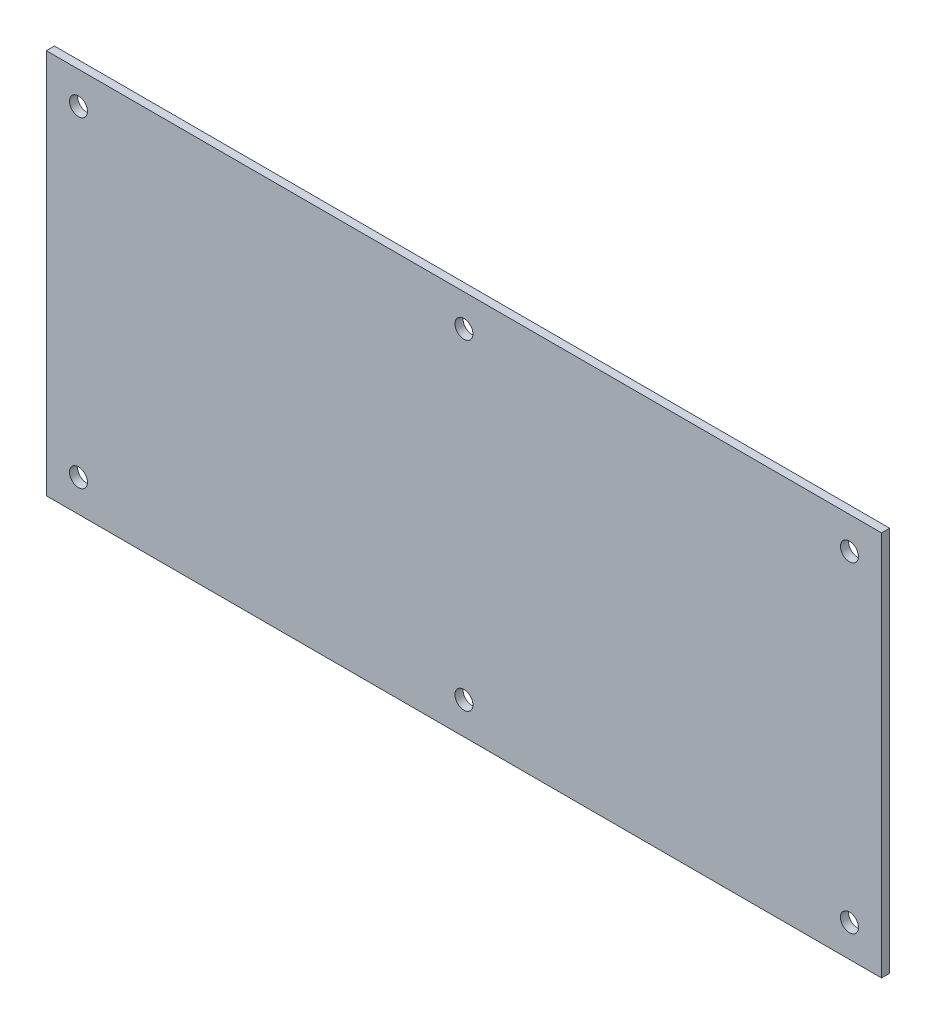
ISO-10303-21;
HEADER;
FILE_DESCRIPTION(('STEP AP214'),'2;1');
FILE_NAME('part.step','',(''),(''),'','','');
FILE_SCHEMA(('AUTOMOTIVE_DESIGN { 1 0 10303 214 1 1 1 1 }'));
ENDSEC;
DATA;
#1=APPLICATION_CONTEXT('core data for automotive mechanical design processes');
#2=APPLICATION_PROTOCOL_DEFINITION('international standard','automotive_design',2000,#1);
#3=PRODUCT_CONTEXT('',#1,'mechanical');
#4=PRODUCT('Part','Part','',(#3));
#5=PRODUCT_RELATED_PRODUCT_CATEGORY('part','',(#4));
#6=PRODUCT_DEFINITION_FORMATION('','',#4);
#7=PRODUCT_DEFINITION_CONTEXT('part definition',#1,'design');
#8=PRODUCT_DEFINITION('design','',#6,#7);
#9=PRODUCT_DEFINITION_SHAPE('','',#8);
#10=(LENGTH_UNIT() NAMED_UNIT(*) SI_UNIT(.MILLI.,.METRE.));
#11=(NAMED_UNIT(*) PLANE_ANGLE_UNIT() SI_UNIT($,.RADIAN.));
#12=(NAMED_UNIT(*) SI_UNIT($,.STERADIAN.) SOLID_ANGLE_UNIT());
#13=UNCERTAINTY_MEASURE_WITH_UNIT(LENGTH_MEASURE(1.E-05),#10,'distance_accuracy_value','');
#14=(GEOMETRIC_REPRESENTATION_CONTEXT(3) GLOBAL_UNCERTAINTY_ASSIGNED_CONTEXT((#13)) GLOBAL_UNIT_ASSIGNED_CONTEXT((#10,
#11,#12)) REPRESENTATION_CONTEXT('',''));
#15=CARTESIAN_POINT('',(0.,0.,0.));
#16=DIRECTION('',(0.,0.,1.));
#17=DIRECTION('',(1.,0.,0.));
#18=AXIS2_PLACEMENT_3D('',#15,#16,#17);
#19=CARTESIAN_POINT('',(0.,0.,-1.6002));
#20=DIRECTION('',(-1.,0.,0.));
#21=DIRECTION('',(0.,0.,1.));
#22=AXIS2_PLACEMENT_3D('',#19,#20,#21);
#23=PLANE('',#22);
#24=DIRECTION('',(0.,-1.,0.));
#25=VECTOR('',#24,1.);
#26=CARTESIAN_POINT('',(0.,0.,0.));
#27=LINE('',#26,#25);
#28=CARTESIAN_POINT('',(0.,76.2,0.));
#29=VERTEX_POINT('',#28);
#30=CARTESIAN_POINT('',(0.,0.,0.));
#31=VERTEX_POINT('',#30);
#32=EDGE_CURVE('E97',#29,#31,#27,.T.);
#33=ORIENTED_EDGE('',*,*,#32,.F.);
#34=DIRECTION('',(0.,0.,1.));
#35=VECTOR('',#34,1.);
#36=CARTESIAN_POINT('',(0.,76.2,-1.6002));
#37=LINE('',#36,#35);
#38=CARTESIAN_POINT('',(0.,76.2,-1.6002));
#39=VERTEX_POINT('',#38);
#40=EDGE_CURVE('E11',#39,#29,#37,.T.);
#41=ORIENTED_EDGE('',*,*,#40,.F.);
#42=DIRECTION('',(0.,-1.,0.));
#43=VECTOR('',#42,1.);
#44=CARTESIAN_POINT('',(0.,0.,-1.6002));
#45=LINE('',#44,#43);
#46=CARTESIAN_POINT('',(0.,0.,-1.6002));
#47=VERTEX_POINT('',#46);
#48=EDGE_CURVE('E90',#39,#47,#45,.T.);
#49=ORIENTED_EDGE('',*,*,#48,.T.);
#50=DIRECTION('',(0.,0.,1.));
#51=VECTOR('',#50,1.);
#52=CARTESIAN_POINT('',(0.,0.,-1.6002));
#53=LINE('',#52,#51);
#54=EDGE_CURVE('E35',#47,#31,#53,.T.);
#55=ORIENTED_EDGE('',*,*,#54,.T.);
#56=EDGE_LOOP('',(#33,#41,#49,#55));
#57=FACE_BOUND('',#56,.T.);
#58=ADVANCED_FACE('F32',(#57),#23,.T.);
#59=CARTESIAN_POINT('',(0.,76.2,-1.6002));
#60=DIRECTION('',(0.,1.,0.));
#61=DIRECTION('',(0.,0.,1.));
#62=AXIS2_PLACEMENT_3D('',#59,#60,#61);
#63=PLANE('',#62);
#64=DIRECTION('',(-1.,0.,0.));
#65=VECTOR('',#64,1.);
#66=CARTESIAN_POINT('',(0.,76.2,0.));
#67=LINE('',#66,#65);
#68=CARTESIAN_POINT('',(165.1,76.2,0.));
#69=VERTEX_POINT('',#68);
#70=EDGE_CURVE('E92',#69,#29,#67,.T.);
#71=ORIENTED_EDGE('',*,*,#70,.F.);
#72=DIRECTION('',(0.,0.,1.));
#73=VECTOR('',#72,1.);
#74=CARTESIAN_POINT('',(165.1,76.2,-1.6002));
#75=LINE('',#74,#73);
#76=CARTESIAN_POINT('',(165.1,76.2,-1.6002));
#77=VERTEX_POINT('',#76);
#78=EDGE_CURVE('E41',#77,#69,#75,.T.);
#79=ORIENTED_EDGE('',*,*,#78,.F.);
#80=DIRECTION('',(-1.,0.,0.));
#81=VECTOR('',#80,1.);
#82=CARTESIAN_POINT('',(0.,76.2,-1.6002));
#83=LINE('',#82,#81);
#84=EDGE_CURVE('E87',#77,#39,#83,.T.);
#85=ORIENTED_EDGE('',*,*,#84,.T.);
#86=ORIENTED_EDGE('',*,*,#40,.T.);
#87=EDGE_LOOP('',(#71,#79,#85,#86));
#88=FACE_BOUND('',#87,.T.);
#89=ADVANCED_FACE('F108',(#88),#63,.T.);
#90=CARTESIAN_POINT('',(165.1,0.,-1.6002));
#91=DIRECTION('',(1.,0.,0.));
#92=DIRECTION('',(0.,0.,-1.));
#93=AXIS2_PLACEMENT_3D('',#90,#91,#92);
#94=PLANE('',#93);
#95=DIRECTION('',(0.,1.,0.));
#96=VECTOR('',#95,1.);
#97=CARTESIAN_POINT('',(165.1,0.,0.));
#98=LINE('',#97,#96);
#99=CARTESIAN_POINT('',(165.1,0.,0.));
#100=VERTEX_POINT('',#99);
#101=EDGE_CURVE('E82',#100,#69,#98,.T.);
#102=ORIENTED_EDGE('',*,*,#101,.F.);
#103=DIRECTION('',(0.,0.,1.));
#104=VECTOR('',#103,1.);
#105=CARTESIAN_POINT('',(165.1,0.,-1.6002));
#106=LINE('',#105,#104);
#107=CARTESIAN_POINT('',(165.1,0.,-1.6002));
#108=VERTEX_POINT('',#107);
#109=EDGE_CURVE('E77',#108,#100,#106,.T.);
#110=ORIENTED_EDGE('',*,*,#109,.F.);
#111=DIRECTION('',(0.,1.,0.));
#112=VECTOR('',#111,1.);
#113=CARTESIAN_POINT('',(165.1,0.,-1.6002));
#114=LINE('',#113,#112);
#115=EDGE_CURVE('E80',#108,#77,#114,.T.);
#116=ORIENTED_EDGE('',*,*,#115,.T.);
#117=ORIENTED_EDGE('',*,*,#78,.T.);
#118=EDGE_LOOP('',(#102,#110,#116,#117));
#119=FACE_BOUND('',#118,.T.);
#120=ADVANCED_FACE('F79',(#119),#94,.T.);
#121=CARTESIAN_POINT('',(0.,0.,-1.6002));
#122=DIRECTION('',(0.,-1.,0.));
#123=DIRECTION('',(0.,0.,-1.));
#124=AXIS2_PLACEMENT_3D('',#121,#122,#123);
#125=PLANE('',#124);
#126=DIRECTION('',(1.,0.,0.));
#127=VECTOR('',#126,1.);
#128=CARTESIAN_POINT('',(0.,0.,0.));
#129=LINE('',#128,#127);
#130=EDGE_CURVE('E100',#31,#100,#129,.T.);
#131=ORIENTED_EDGE('',*,*,#130,.F.);
#132=ORIENTED_EDGE('',*,*,#54,.F.);
#133=DIRECTION('',(1.,0.,0.));
#134=VECTOR('',#133,1.);
#135=CARTESIAN_POINT('',(0.,0.,-1.6002));
#136=LINE('',#135,#134);
#137=EDGE_CURVE('E86',#47,#108,#136,.T.);
#138=ORIENTED_EDGE('',*,*,#137,.T.);
#139=ORIENTED_EDGE('',*,*,#109,.T.);
#140=EDGE_LOOP('',(#131,#132,#138,#139));
#141=FACE_BOUND('',#140,.T.);
#142=ADVANCED_FACE('F89',(#141),#125,.T.);
#143=CARTESIAN_POINT('',(0.,76.2,-1.6002));
#144=DIRECTION('',(0.,0.,-1.));
#145=DIRECTION('',(-1.,0.,0.));
#146=AXIS2_PLACEMENT_3D('',#143,#144,#145);
#147=PLANE('',#146);
#148=CARTESIAN_POINT('',(82.55,69.85,-1.6002));
#149=DIRECTION('',(0.,0.,-1.));
#150=DIRECTION('',(-1.,0.,0.));
#151=AXIS2_PLACEMENT_3D('',#148,#149,#150);
#152=CIRCLE('',#151,1.778);
#153=CARTESIAN_POINT('',(80.772,69.85,-1.6002));
#154=VERTEX_POINT('',#153);
#155=EDGE_CURVE('E157',#154,#154,#152,.T.);
#156=ORIENTED_EDGE('',*,*,#155,.F.);
#157=EDGE_LOOP('',(#156));
#158=FACE_BOUND('',#157,.T.);
#159=CARTESIAN_POINT('',(82.55,6.35,-1.6002));
#160=DIRECTION('',(0.,0.,-1.));
#161=DIRECTION('',(-1.,0.,0.));
#162=AXIS2_PLACEMENT_3D('',#159,#160,#161);
#163=CIRCLE('',#162,1.77800000000001);
#164=CARTESIAN_POINT('',(80.772,6.35,-1.6002));
#165=VERTEX_POINT('',#164);
#166=EDGE_CURVE('E167',#165,#165,#163,.T.);
#167=ORIENTED_EDGE('',*,*,#166,.F.);
#168=EDGE_LOOP('',(#167));
#169=FACE_BOUND('',#168,.T.);
#170=CARTESIAN_POINT('',(6.34999999999999,6.35,-1.6002));
#171=DIRECTION('',(0.,0.,-1.));
#172=DIRECTION('',(-1.,0.,0.));
#173=AXIS2_PLACEMENT_3D('',#170,#171,#172);
#174=CIRCLE('',#173,1.778);
#175=CARTESIAN_POINT('',(4.57199999999999,6.35,-1.6002));
#176=VERTEX_POINT('',#175);
#177=EDGE_CURVE('E173',#176,#176,#174,.T.);
#178=ORIENTED_EDGE('',*,*,#177,.F.);
#179=EDGE_LOOP('',(#178));
#180=FACE_BOUND('',#179,.T.);
#181=CARTESIAN_POINT('',(158.75,6.35,-1.6002));
#182=DIRECTION('',(0.,0.,-1.));
#183=DIRECTION('',(-1.,0.,0.));
#184=AXIS2_PLACEMENT_3D('',#181,#182,#183);
#185=CIRCLE('',#184,1.77800000000001);
#186=CARTESIAN_POINT('',(156.972,6.35,-1.6002));
#187=VERTEX_POINT('',#186);
#188=EDGE_CURVE('E179',#187,#187,#185,.T.);
#189=ORIENTED_EDGE('',*,*,#188,.F.);
#190=EDGE_LOOP('',(#189));
#191=FACE_BOUND('',#190,.T.);
#192=CARTESIAN_POINT('',(158.75,69.85,-1.6002));
#193=DIRECTION('',(0.,0.,-1.));
#194=DIRECTION('',(-1.,0.,0.));
#195=AXIS2_PLACEMENT_3D('',#192,#193,#194);
#196=CIRCLE('',#195,1.778);
#197=CARTESIAN_POINT('',(156.972,69.85,-1.6002));
#198=VERTEX_POINT('',#197);
#199=EDGE_CURVE('E185',#198,#198,#196,.T.);
#200=ORIENTED_EDGE('',*,*,#199,.F.);
#201=EDGE_LOOP('',(#200));
#202=FACE_BOUND('',#201,.T.);
#203=CARTESIAN_POINT('',(6.35,69.85,-1.6002));
#204=DIRECTION('',(0.,0.,-1.));
#205=DIRECTION('',(-1.,0.,0.));
#206=AXIS2_PLACEMENT_3D('',#203,#204,#205);
#207=CIRCLE('',#206,1.778);
#208=CARTESIAN_POINT('',(4.572,69.85,-1.6002));
#209=VERTEX_POINT('',#208);
#210=EDGE_CURVE('E101',#209,#209,#207,.T.);
#211=ORIENTED_EDGE('',*,*,#210,.F.);
#212=EDGE_LOOP('',(#211));
#213=FACE_BOUND('',#212,.T.);
#214=ORIENTED_EDGE('',*,*,#48,.F.);
#215=ORIENTED_EDGE('',*,*,#84,.F.);
#216=ORIENTED_EDGE('',*,*,#115,.F.);
#217=ORIENTED_EDGE('',*,*,#137,.F.);
#218=EDGE_LOOP('',(#214,#215,#216,#217));
#219=FACE_BOUND('',#218,.T.);
#220=ADVANCED_FACE('F85',(#158,#169,#180,#191,#202,#213,#219),#147,.T.);
#221=CARTESIAN_POINT('',(0.,76.2,0.));
#222=DIRECTION('',(0.,0.,-1.));
#223=DIRECTION('',(-1.,0.,0.));
#224=AXIS2_PLACEMENT_3D('',#221,#222,#223);
#225=PLANE('',#224);
#226=CARTESIAN_POINT('',(82.55,69.85,0.));
#227=DIRECTION('',(0.,0.,1.));
#228=DIRECTION('',(1.,0.,0.));
#229=AXIS2_PLACEMENT_3D('',#226,#227,#228);
#230=CIRCLE('',#229,1.778);
#231=CARTESIAN_POINT('',(84.328,69.85,0.));
#232=VERTEX_POINT('',#231);
#233=EDGE_CURVE('E160',#232,#232,#230,.T.);
#234=ORIENTED_EDGE('',*,*,#233,.F.);
#235=EDGE_LOOP('',(#234));
#236=FACE_BOUND('',#235,.T.);
#237=CARTESIAN_POINT('',(82.55,6.35,0.));
#238=DIRECTION('',(0.,0.,1.));
#239=DIRECTION('',(1.,0.,0.));
#240=AXIS2_PLACEMENT_3D('',#237,#238,#239);
#241=CIRCLE('',#240,1.77800000000001);
#242=CARTESIAN_POINT('',(84.328,6.35,0.));
#243=VERTEX_POINT('',#242);
#244=EDGE_CURVE('E162',#243,#243,#241,.T.);
#245=ORIENTED_EDGE('',*,*,#244,.F.);
#246=EDGE_LOOP('',(#245));
#247=FACE_BOUND('',#246,.T.);
#248=CARTESIAN_POINT('',(6.34999999999999,6.35,0.));
#249=DIRECTION('',(0.,0.,1.));
#250=DIRECTION('',(1.,0.,0.));
#251=AXIS2_PLACEMENT_3D('',#248,#249,#250);
#252=CIRCLE('',#251,1.778);
#253=CARTESIAN_POINT('',(8.12799999999999,6.35,0.));
#254=VERTEX_POINT('',#253);
#255=EDGE_CURVE('E170',#254,#254,#252,.T.);
#256=ORIENTED_EDGE('',*,*,#255,.F.);
#257=EDGE_LOOP('',(#256));
#258=FACE_BOUND('',#257,.T.);
#259=CARTESIAN_POINT('',(158.75,6.35,0.));
#260=DIRECTION('',(0.,0.,1.));
#261=DIRECTION('',(1.,0.,0.));
#262=AXIS2_PLACEMENT_3D('',#259,#260,#261);
#263=CIRCLE('',#262,1.77800000000001);
#264=CARTESIAN_POINT('',(160.528,6.35,0.));
#265=VERTEX_POINT('',#264);
#266=EDGE_CURVE('E176',#265,#265,#263,.T.);
#267=ORIENTED_EDGE('',*,*,#266,.F.);
#268=EDGE_LOOP('',(#267));
#269=FACE_BOUND('',#268,.T.);
#270=CARTESIAN_POINT('',(158.75,69.85,0.));
#271=DIRECTION('',(0.,0.,1.));
#272=DIRECTION('',(1.,0.,0.));
#273=AXIS2_PLACEMENT_3D('',#270,#271,#272);
#274=CIRCLE('',#273,1.778);
#275=CARTESIAN_POINT('',(160.528,69.85,0.));
#276=VERTEX_POINT('',#275);
#277=EDGE_CURVE('E182',#276,#276,#274,.T.);
#278=ORIENTED_EDGE('',*,*,#277,.F.);
#279=EDGE_LOOP('',(#278));
#280=FACE_BOUND('',#279,.T.);
#281=CARTESIAN_POINT('',(6.35,69.85,0.));
#282=DIRECTION('',(0.,0.,1.));
#283=DIRECTION('',(1.,0.,0.));
#284=AXIS2_PLACEMENT_3D('',#281,#282,#283);
#285=CIRCLE('',#284,1.778);
#286=CARTESIAN_POINT('',(8.128,69.85,0.));
#287=VERTEX_POINT('',#286);
#288=EDGE_CURVE('E188',#287,#287,#285,.T.);
#289=ORIENTED_EDGE('',*,*,#288,.F.);
#290=EDGE_LOOP('',(#289));
#291=FACE_BOUND('',#290,.T.);
#292=ORIENTED_EDGE('',*,*,#32,.T.);
#293=ORIENTED_EDGE('',*,*,#130,.T.);
#294=ORIENTED_EDGE('',*,*,#101,.T.);
#295=ORIENTED_EDGE('',*,*,#70,.T.);
#296=EDGE_LOOP('',(#292,#293,#294,#295));
#297=FACE_BOUND('',#296,.T.);
#298=ADVANCED_FACE('F107',(#236,#247,#258,#269,#280,#291,#297),#225,.F.);
#299=CARTESIAN_POINT('',(6.35,69.85,-2.54));
#300=DIRECTION('',(0.,0.,1.));
#301=DIRECTION('',(1.,0.,0.));
#302=AXIS2_PLACEMENT_3D('',#299,#300,#301);
#303=CYLINDRICAL_SURFACE('',#302,1.778);
#304=ORIENTED_EDGE('',*,*,#210,.T.);
#305=EDGE_LOOP('',(#304));
#306=FACE_BOUND('',#305,.T.);
#307=ORIENTED_EDGE('',*,*,#288,.T.);
#308=EDGE_LOOP('',(#307));
#309=FACE_BOUND('',#308,.T.);
#310=ADVANCED_FACE('F126',(#306,#309),#303,.F.);
#311=CARTESIAN_POINT('',(158.75,69.85,-2.54));
#312=DIRECTION('',(0.,0.,1.));
#313=DIRECTION('',(1.,0.,0.));
#314=AXIS2_PLACEMENT_3D('',#311,#312,#313);
#315=CYLINDRICAL_SURFACE('',#314,1.778);
#316=ORIENTED_EDGE('',*,*,#199,.T.);
#317=EDGE_LOOP('',(#316));
#318=FACE_BOUND('',#317,.T.);
#319=ORIENTED_EDGE('',*,*,#277,.T.);
#320=EDGE_LOOP('',(#319));
#321=FACE_BOUND('',#320,.T.);
#322=ADVANCED_FACE('F133',(#318,#321),#315,.F.);
#323=CARTESIAN_POINT('',(158.75,6.35,-2.54));
#324=DIRECTION('',(0.,0.,1.));
#325=DIRECTION('',(1.,0.,0.));
#326=AXIS2_PLACEMENT_3D('',#323,#324,#325);
#327=CYLINDRICAL_SURFACE('',#326,1.77800000000001);
#328=ORIENTED_EDGE('',*,*,#188,.T.);
#329=EDGE_LOOP('',(#328));
#330=FACE_BOUND('',#329,.T.);
#331=ORIENTED_EDGE('',*,*,#266,.T.);
#332=EDGE_LOOP('',(#331));
#333=FACE_BOUND('',#332,.T.);
#334=ADVANCED_FACE('F137',(#330,#333),#327,.F.);
#335=CARTESIAN_POINT('',(6.34999999999999,6.35,-2.54));
#336=DIRECTION('',(0.,0.,1.));
#337=DIRECTION('',(1.,0.,0.));
#338=AXIS2_PLACEMENT_3D('',#335,#336,#337);
#339=CYLINDRICAL_SURFACE('',#338,1.778);
#340=ORIENTED_EDGE('',*,*,#177,.T.);
#341=EDGE_LOOP('',(#340));
#342=FACE_BOUND('',#341,.T.);
#343=ORIENTED_EDGE('',*,*,#255,.T.);
#344=EDGE_LOOP('',(#343));
#345=FACE_BOUND('',#344,.T.);
#346=ADVANCED_FACE('F141',(#342,#345),#339,.F.);
#347=CARTESIAN_POINT('',(82.55,6.35,-2.54));
#348=DIRECTION('',(0.,0.,1.));
#349=DIRECTION('',(1.,0.,0.));
#350=AXIS2_PLACEMENT_3D('',#347,#348,#349);
#351=CYLINDRICAL_SURFACE('',#350,1.77800000000001);
#352=ORIENTED_EDGE('',*,*,#166,.T.);
#353=EDGE_LOOP('',(#352));
#354=FACE_BOUND('',#353,.T.);
#355=ORIENTED_EDGE('',*,*,#244,.T.);
#356=EDGE_LOOP('',(#355));
#357=FACE_BOUND('',#356,.T.);
#358=ADVANCED_FACE('F145',(#354,#357),#351,.F.);
#359=CARTESIAN_POINT('',(82.55,69.85,-2.54));
#360=DIRECTION('',(0.,0.,1.));
#361=DIRECTION('',(1.,0.,0.));
#362=AXIS2_PLACEMENT_3D('',#359,#360,#361);
#363=CYLINDRICAL_SURFACE('',#362,1.778);
#364=ORIENTED_EDGE('',*,*,#155,.T.);
#365=EDGE_LOOP('',(#364));
#366=FACE_BOUND('',#365,.T.);
#367=ORIENTED_EDGE('',*,*,#233,.T.);
#368=EDGE_LOOP('',(#367));
#369=FACE_BOUND('',#368,.T.);
#370=ADVANCED_FACE('F149',(#366,#369),#363,.F.);
#371=CLOSED_SHELL('',(#58,#89,#120,#142,#220,#298,#310,#322,#334,#346,#358,#370));
#372=MANIFOLD_SOLID_BREP('B2',#371);
#373=ADVANCED_BREP_SHAPE_REPRESENTATION('',(#18,#372),#14);
#374=SHAPE_DEFINITION_REPRESENTATION(#9,#373);
ENDSEC;
END-ISO-10303-21;
